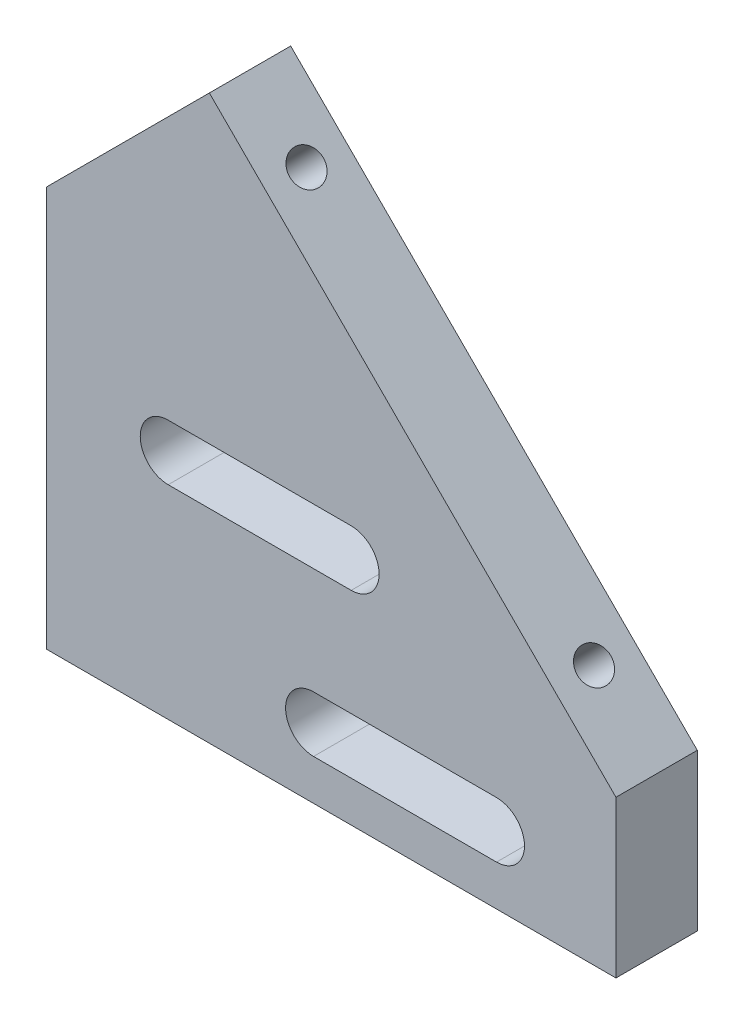
ISO-10303-21;
HEADER;
FILE_DESCRIPTION(('STEP AP214'),'2;1');
FILE_NAME('part.step','',(''),(''),'','','');
FILE_SCHEMA(('AUTOMOTIVE_DESIGN { 1 0 10303 214 1 1 1 1 }'));
ENDSEC;
DATA;
#1=APPLICATION_CONTEXT('core data for automotive mechanical design processes');
#2=APPLICATION_PROTOCOL_DEFINITION('international standard','automotive_design',2000,#1);
#3=PRODUCT_CONTEXT('',#1,'mechanical');
#4=PRODUCT('Part','Part','',(#3));
#5=PRODUCT_RELATED_PRODUCT_CATEGORY('part','',(#4));
#6=PRODUCT_DEFINITION_FORMATION('','',#4);
#7=PRODUCT_DEFINITION_CONTEXT('part definition',#1,'design');
#8=PRODUCT_DEFINITION('design','',#6,#7);
#9=PRODUCT_DEFINITION_SHAPE('','',#8);
#10=(LENGTH_UNIT() NAMED_UNIT(*) SI_UNIT(.MILLI.,.METRE.));
#11=(NAMED_UNIT(*) PLANE_ANGLE_UNIT() SI_UNIT($,.RADIAN.));
#12=(NAMED_UNIT(*) SI_UNIT($,.STERADIAN.) SOLID_ANGLE_UNIT());
#13=UNCERTAINTY_MEASURE_WITH_UNIT(LENGTH_MEASURE(1.E-05),#10,'distance_accuracy_value','');
#14=(GEOMETRIC_REPRESENTATION_CONTEXT(3) GLOBAL_UNCERTAINTY_ASSIGNED_CONTEXT((#13)) GLOBAL_UNIT_ASSIGNED_CONTEXT((#10,
#11,#12)) REPRESENTATION_CONTEXT('',''));
#15=CARTESIAN_POINT('',(0.,0.,0.));
#16=DIRECTION('',(0.,0.,1.));
#17=DIRECTION('',(1.,0.,0.));
#18=AXIS2_PLACEMENT_3D('',#15,#16,#17);
#19=CARTESIAN_POINT('',(49.842135623731,21.5578643762692,4.));
#20=DIRECTION('',(0.707106781186546,0.707106781186549,0.));
#21=DIRECTION('',(0.,0.,-1.));
#22=AXIS2_PLACEMENT_3D('',#19,#20,#21);
#23=CYLINDRICAL_SURFACE('',#22,1.64999999999999);
#24=CARTESIAN_POINT('',(41.7104076400857,13.4261363926239,4.));
#25=DIRECTION('',(0.707106781186546,0.707106781186549,0.));
#26=DIRECTION('',(0.,0.,-1.));
#27=AXIS2_PLACEMENT_3D('',#24,#25,#26);
#28=CIRCLE('',#27,1.64999999999999);
#29=CARTESIAN_POINT('',(41.7104076400857,13.4261363926239,2.35000000000002));
#30=VERTEX_POINT('',#29);
#31=EDGE_CURVE('E25',#30,#30,#28,.T.);
#32=ORIENTED_EDGE('',*,*,#31,.F.);
#33=EDGE_LOOP('',(#32));
#34=FACE_BOUND('',#33,.T.);
#35=CARTESIAN_POINT('',(49.842135623731,21.5578643762692,4.));
#36=DIRECTION('',(0.707106781186546,0.707106781186549,0.));
#37=DIRECTION('',(0.,0.,-1.));
#38=AXIS2_PLACEMENT_3D('',#35,#36,#37);
#39=CIRCLE('',#38,1.64999999999999);
#40=CARTESIAN_POINT('',(49.842135623731,21.5578643762692,2.35000000000001));
#41=VERTEX_POINT('',#40);
#42=EDGE_CURVE('E11',#41,#41,#39,.T.);
#43=ORIENTED_EDGE('',*,*,#42,.T.);
#44=EDGE_LOOP('',(#43));
#45=FACE_BOUND('',#44,.T.);
#46=ADVANCED_FACE('F16',(#34,#45),#23,.F.);
#47=CARTESIAN_POINT('',(41.7104076400857,13.4261363926239,4.));
#48=DIRECTION('',(0.707106781186546,0.707106781186549,0.));
#49=DIRECTION('',(0.,0.,-1.));
#50=AXIS2_PLACEMENT_3D('',#47,#48,#49);
#51=CONICAL_SURFACE('',#50,1.64999999999999,1.02974425867665);
#52=CARTESIAN_POINT('',(41.0093678199528,12.725096572491,4.));
#53=VERTEX_POINT('',#52);
#54=VERTEX_LOOP('',#53);
#55=FACE_BOUND('',#54,.T.);
#56=ORIENTED_EDGE('',*,*,#31,.T.);
#57=EDGE_LOOP('',(#56));
#58=FACE_BOUND('',#57,.T.);
#59=ADVANCED_FACE('F257',(#55,#58),#51,.F.);
#60=CARTESIAN_POINT('',(21.557864376269,49.842135623731,4.));
#61=DIRECTION('',(0.707106781186546,0.707106781186549,0.));
#62=DIRECTION('',(0.,0.,-1.));
#63=AXIS2_PLACEMENT_3D('',#60,#61,#62);
#64=CYLINDRICAL_SURFACE('',#63,1.64999999999999);
#65=CARTESIAN_POINT('',(13.4261363926237,41.7104076400857,4.));
#66=DIRECTION('',(0.707106781186546,0.707106781186549,0.));
#67=DIRECTION('',(0.,0.,-1.));
#68=AXIS2_PLACEMENT_3D('',#65,#66,#67);
#69=CIRCLE('',#68,1.64999999999999);
#70=CARTESIAN_POINT('',(13.4261363926237,41.7104076400857,2.35000000000001));
#71=VERTEX_POINT('',#70);
#72=EDGE_CURVE('E130',#71,#71,#69,.T.);
#73=ORIENTED_EDGE('',*,*,#72,.F.);
#74=EDGE_LOOP('',(#73));
#75=FACE_BOUND('',#74,.T.);
#76=CARTESIAN_POINT('',(21.557864376269,49.842135623731,4.));
#77=DIRECTION('',(0.707106781186546,0.707106781186549,0.));
#78=DIRECTION('',(0.,0.,-1.));
#79=AXIS2_PLACEMENT_3D('',#76,#77,#78);
#80=CIRCLE('',#79,1.64999999999999);
#81=CARTESIAN_POINT('',(21.557864376269,49.842135623731,2.35000000000001));
#82=VERTEX_POINT('',#81);
#83=EDGE_CURVE('E249',#82,#82,#80,.T.);
#84=ORIENTED_EDGE('',*,*,#83,.T.);
#85=EDGE_LOOP('',(#84));
#86=FACE_BOUND('',#85,.T.);
#87=ADVANCED_FACE('F273',(#75,#86),#64,.F.);
#88=CARTESIAN_POINT('',(13.4261363926237,41.7104076400857,4.));
#89=DIRECTION('',(0.707106781186546,0.707106781186549,0.));
#90=DIRECTION('',(0.,0.,-1.));
#91=AXIS2_PLACEMENT_3D('',#88,#89,#90);
#92=CONICAL_SURFACE('',#91,1.64999999999999,1.02974425867665);
#93=CARTESIAN_POINT('',(12.7250965724909,41.0093678199529,4.));
#94=VERTEX_POINT('',#93);
#95=VERTEX_LOOP('',#94);
#96=FACE_BOUND('',#95,.T.);
#97=ORIENTED_EDGE('',*,*,#72,.T.);
#98=EDGE_LOOP('',(#97));
#99=FACE_BOUND('',#98,.T.);
#100=ADVANCED_FACE('F275',(#96,#99),#92,.F.);
#101=CARTESIAN_POINT('',(11.95,22.75,8.));
#102=DIRECTION('',(0.,0.,-1.));
#103=DIRECTION('',(0.,-1.,0.));
#104=AXIS2_PLACEMENT_3D('',#101,#102,#103);
#105=CYLINDRICAL_SURFACE('',#104,2.75);
#106=CARTESIAN_POINT('',(11.95,22.75,8.));
#107=DIRECTION('',(0.,0.,1.));
#108=DIRECTION('',(1.,0.,0.));
#109=AXIS2_PLACEMENT_3D('',#106,#107,#108);
#110=CIRCLE('',#109,2.75);
#111=CARTESIAN_POINT('',(11.95,25.5,8.));
#112=VERTEX_POINT('',#111);
#113=CARTESIAN_POINT('',(11.95,20.,8.));
#114=VERTEX_POINT('',#113);
#115=EDGE_CURVE('E117',#112,#114,#110,.T.);
#116=ORIENTED_EDGE('',*,*,#115,.T.);
#117=DIRECTION('',(0.,0.,-1.));
#118=VECTOR('',#117,1.);
#119=CARTESIAN_POINT('',(11.95,20.,8.));
#120=LINE('',#119,#118);
#121=CARTESIAN_POINT('',(11.95,20.,0.));
#122=VERTEX_POINT('',#121);
#123=EDGE_CURVE('E131',#114,#122,#120,.T.);
#124=ORIENTED_EDGE('',*,*,#123,.T.);
#125=CARTESIAN_POINT('',(11.95,22.75,0.));
#126=DIRECTION('',(0.,0.,1.));
#127=DIRECTION('',(1.,0.,0.));
#128=AXIS2_PLACEMENT_3D('',#125,#126,#127);
#129=CIRCLE('',#128,2.75);
#130=CARTESIAN_POINT('',(11.95,25.5,0.));
#131=VERTEX_POINT('',#130);
#132=EDGE_CURVE('E119',#131,#122,#129,.T.);
#133=ORIENTED_EDGE('',*,*,#132,.F.);
#134=DIRECTION('',(0.,0.,-1.));
#135=VECTOR('',#134,1.);
#136=CARTESIAN_POINT('',(11.95,25.5,8.));
#137=LINE('',#136,#135);
#138=EDGE_CURVE('E113',#112,#131,#137,.T.);
#139=ORIENTED_EDGE('',*,*,#138,.F.);
#140=EDGE_LOOP('',(#116,#124,#133,#139));
#141=FACE_BOUND('',#140,.T.);
#142=ADVANCED_FACE('F115',(#141),#105,.F.);
#143=CARTESIAN_POINT('',(26.25,6.75,8.));
#144=DIRECTION('',(0.,0.,-1.));
#145=DIRECTION('',(0.,-1.,0.));
#146=AXIS2_PLACEMENT_3D('',#143,#144,#145);
#147=CYLINDRICAL_SURFACE('',#146,2.75);
#148=CARTESIAN_POINT('',(26.25,6.75,8.));
#149=DIRECTION('',(0.,0.,1.));
#150=DIRECTION('',(1.,0.,0.));
#151=AXIS2_PLACEMENT_3D('',#148,#149,#150);
#152=CIRCLE('',#151,2.75);
#153=CARTESIAN_POINT('',(26.25,9.5,8.));
#154=VERTEX_POINT('',#153);
#155=CARTESIAN_POINT('',(26.25,4.,8.));
#156=VERTEX_POINT('',#155);
#157=EDGE_CURVE('E243',#154,#156,#152,.T.);
#158=ORIENTED_EDGE('',*,*,#157,.T.);
#159=DIRECTION('',(0.,0.,-1.));
#160=VECTOR('',#159,1.);
#161=CARTESIAN_POINT('',(26.25,4.,8.));
#162=LINE('',#161,#160);
#163=CARTESIAN_POINT('',(26.25,4.,0.));
#164=VERTEX_POINT('',#163);
#165=EDGE_CURVE('E214',#156,#164,#162,.T.);
#166=ORIENTED_EDGE('',*,*,#165,.T.);
#167=CARTESIAN_POINT('',(26.25,6.75,0.));
#168=DIRECTION('',(0.,0.,1.));
#169=DIRECTION('',(1.,0.,0.));
#170=AXIS2_PLACEMENT_3D('',#167,#168,#169);
#171=CIRCLE('',#170,2.75);
#172=CARTESIAN_POINT('',(26.25,9.5,0.));
#173=VERTEX_POINT('',#172);
#174=EDGE_CURVE('E171',#173,#164,#171,.T.);
#175=ORIENTED_EDGE('',*,*,#174,.F.);
#176=DIRECTION('',(0.,0.,-1.));
#177=VECTOR('',#176,1.);
#178=CARTESIAN_POINT('',(26.25,9.5,8.));
#179=LINE('',#178,#177);
#180=EDGE_CURVE('E202',#154,#173,#179,.T.);
#181=ORIENTED_EDGE('',*,*,#180,.F.);
#182=EDGE_LOOP('',(#158,#166,#175,#181));
#183=FACE_BOUND('',#182,.T.);
#184=ADVANCED_FACE('F289',(#183),#147,.F.);
#185=CARTESIAN_POINT('',(0.,0.,8.));
#186=DIRECTION('',(0.,0.,1.));
#187=DIRECTION('',(1.,0.,0.));
#188=AXIS2_PLACEMENT_3D('',#185,#186,#187);
#189=PLANE('',#188);
#190=DIRECTION('',(0.,-1.,0.));
#191=VECTOR('',#190,1.);
#192=CARTESIAN_POINT('',(0.,39.4,8.));
#193=LINE('',#192,#191);
#194=CARTESIAN_POINT('',(0.,39.4,8.));
#195=VERTEX_POINT('',#194);
#196=CARTESIAN_POINT('',(0.,0.,8.));
#197=VERTEX_POINT('',#196);
#198=EDGE_CURVE('E211',#195,#197,#193,.T.);
#199=ORIENTED_EDGE('',*,*,#198,.T.);
#200=DIRECTION('',(1.,0.,0.));
#201=VECTOR('',#200,1.);
#202=CARTESIAN_POINT('',(0.,0.,8.));
#203=LINE('',#202,#201);
#204=CARTESIAN_POINT('',(56.,0.,8.));
#205=VERTEX_POINT('',#204);
#206=EDGE_CURVE('E215',#197,#205,#203,.T.);
#207=ORIENTED_EDGE('',*,*,#206,.T.);
#208=DIRECTION('',(0.,1.,0.));
#209=VECTOR('',#208,1.);
#210=CARTESIAN_POINT('',(56.,0.,8.));
#211=LINE('',#210,#209);
#212=CARTESIAN_POINT('',(56.,15.4000000000002,8.));
#213=VERTEX_POINT('',#212);
#214=EDGE_CURVE('E218',#205,#213,#211,.T.);
#215=ORIENTED_EDGE('',*,*,#214,.T.);
#216=DIRECTION('',(-0.707106781186549,0.707106781186546,0.));
#217=VECTOR('',#216,1.);
#218=CARTESIAN_POINT('',(56.,15.4000000000002,8.));
#219=LINE('',#218,#217);
#220=CARTESIAN_POINT('',(16.,55.4,8.));
#221=VERTEX_POINT('',#220);
#222=EDGE_CURVE('E221',#213,#221,#219,.T.);
#223=ORIENTED_EDGE('',*,*,#222,.T.);
#224=DIRECTION('',(-0.707106781186549,-0.707106781186546,0.));
#225=VECTOR('',#224,1.);
#226=CARTESIAN_POINT('',(16.,55.4,8.));
#227=LINE('',#226,#225);
#228=EDGE_CURVE('E224',#221,#195,#227,.T.);
#229=ORIENTED_EDGE('',*,*,#228,.T.);
#230=EDGE_LOOP('',(#199,#207,#215,#223,#229));
#231=FACE_BOUND('',#230,.T.);
#232=DIRECTION('',(1.,0.,0.));
#233=VECTOR('',#232,1.);
#234=CARTESIAN_POINT('',(26.25,4.,8.));
#235=LINE('',#234,#233);
#236=CARTESIAN_POINT('',(44.25,4.00000000000001,8.));
#237=VERTEX_POINT('',#236);
#238=EDGE_CURVE('E190',#156,#237,#235,.T.);
#239=ORIENTED_EDGE('',*,*,#238,.F.);
#240=ORIENTED_EDGE('',*,*,#157,.F.);
#241=DIRECTION('',(-1.,0.,0.));
#242=VECTOR('',#241,1.);
#243=CARTESIAN_POINT('',(26.25,9.5,8.));
#244=LINE('',#243,#242);
#245=CARTESIAN_POINT('',(44.25,9.5,8.));
#246=VERTEX_POINT('',#245);
#247=EDGE_CURVE('E197',#246,#154,#244,.T.);
#248=ORIENTED_EDGE('',*,*,#247,.F.);
#249=CARTESIAN_POINT('',(44.25,6.75,8.));
#250=DIRECTION('',(0.,0.,1.));
#251=DIRECTION('',(1.,0.,0.));
#252=AXIS2_PLACEMENT_3D('',#249,#250,#251);
#253=CIRCLE('',#252,2.75);
#254=EDGE_CURVE('E194',#237,#246,#253,.T.);
#255=ORIENTED_EDGE('',*,*,#254,.F.);
#256=EDGE_LOOP('',(#239,#240,#248,#255));
#257=FACE_BOUND('',#256,.T.);
#258=DIRECTION('',(1.,0.,0.));
#259=VECTOR('',#258,1.);
#260=CARTESIAN_POINT('',(11.95,20.,8.));
#261=LINE('',#260,#259);
#262=CARTESIAN_POINT('',(29.95,20.,8.));
#263=VERTEX_POINT('',#262);
#264=EDGE_CURVE('E129',#114,#263,#261,.T.);
#265=ORIENTED_EDGE('',*,*,#264,.F.);
#266=ORIENTED_EDGE('',*,*,#115,.F.);
#267=DIRECTION('',(-1.,0.,0.));
#268=VECTOR('',#267,1.);
#269=CARTESIAN_POINT('',(11.95,25.5,8.));
#270=LINE('',#269,#268);
#271=CARTESIAN_POINT('',(29.95,25.5,8.));
#272=VERTEX_POINT('',#271);
#273=EDGE_CURVE('E123',#272,#112,#270,.T.);
#274=ORIENTED_EDGE('',*,*,#273,.F.);
#275=CARTESIAN_POINT('',(29.95,22.75,8.));
#276=DIRECTION('',(0.,0.,1.));
#277=DIRECTION('',(1.,0.,0.));
#278=AXIS2_PLACEMENT_3D('',#275,#276,#277);
#279=CIRCLE('',#278,2.75);
#280=EDGE_CURVE('E137',#263,#272,#279,.T.);
#281=ORIENTED_EDGE('',*,*,#280,.F.);
#282=EDGE_LOOP('',(#265,#266,#274,#281));
#283=FACE_BOUND('',#282,.T.);
#284=ADVANCED_FACE('F126',(#231,#257,#283),#189,.T.);
#285=CARTESIAN_POINT('',(0.,0.,0.));
#286=DIRECTION('',(0.,0.,1.));
#287=DIRECTION('',(1.,0.,0.));
#288=AXIS2_PLACEMENT_3D('',#285,#286,#287);
#289=PLANE('',#288);
#290=DIRECTION('',(0.,-1.,0.));
#291=VECTOR('',#290,1.);
#292=CARTESIAN_POINT('',(0.,39.4,0.));
#293=LINE('',#292,#291);
#294=CARTESIAN_POINT('',(0.,39.4,0.));
#295=VERTEX_POINT('',#294);
#296=CARTESIAN_POINT('',(0.,0.,0.));
#297=VERTEX_POINT('',#296);
#298=EDGE_CURVE('E143',#295,#297,#293,.T.);
#299=ORIENTED_EDGE('',*,*,#298,.F.);
#300=DIRECTION('',(-0.707106781186549,-0.707106781186546,0.));
#301=VECTOR('',#300,1.);
#302=CARTESIAN_POINT('',(16.,55.4,0.));
#303=LINE('',#302,#301);
#304=CARTESIAN_POINT('',(16.,55.4,0.));
#305=VERTEX_POINT('',#304);
#306=EDGE_CURVE('E148',#305,#295,#303,.T.);
#307=ORIENTED_EDGE('',*,*,#306,.F.);
#308=DIRECTION('',(-0.707106781186549,0.707106781186546,0.));
#309=VECTOR('',#308,1.);
#310=CARTESIAN_POINT('',(56.,15.4000000000002,0.));
#311=LINE('',#310,#309);
#312=CARTESIAN_POINT('',(56.,15.4000000000002,0.));
#313=VERTEX_POINT('',#312);
#314=EDGE_CURVE('E152',#313,#305,#311,.T.);
#315=ORIENTED_EDGE('',*,*,#314,.F.);
#316=DIRECTION('',(0.,1.,0.));
#317=VECTOR('',#316,1.);
#318=CARTESIAN_POINT('',(56.,0.,0.));
#319=LINE('',#318,#317);
#320=CARTESIAN_POINT('',(56.,0.,0.));
#321=VERTEX_POINT('',#320);
#322=EDGE_CURVE('E156',#321,#313,#319,.T.);
#323=ORIENTED_EDGE('',*,*,#322,.F.);
#324=DIRECTION('',(1.,0.,0.));
#325=VECTOR('',#324,1.);
#326=CARTESIAN_POINT('',(0.,0.,0.));
#327=LINE('',#326,#325);
#328=EDGE_CURVE('E160',#297,#321,#327,.T.);
#329=ORIENTED_EDGE('',*,*,#328,.F.);
#330=EDGE_LOOP('',(#299,#307,#315,#323,#329));
#331=FACE_BOUND('',#330,.T.);
#332=ORIENTED_EDGE('',*,*,#132,.T.);
#333=DIRECTION('',(1.,0.,0.));
#334=VECTOR('',#333,1.);
#335=CARTESIAN_POINT('',(11.95,20.,0.));
#336=LINE('',#335,#334);
#337=CARTESIAN_POINT('',(29.95,20.,0.));
#338=VERTEX_POINT('',#337);
#339=EDGE_CURVE('E163',#122,#338,#336,.T.);
#340=ORIENTED_EDGE('',*,*,#339,.T.);
#341=CARTESIAN_POINT('',(29.95,22.75,0.));
#342=DIRECTION('',(0.,0.,1.));
#343=DIRECTION('',(1.,0.,0.));
#344=AXIS2_PLACEMENT_3D('',#341,#342,#343);
#345=CIRCLE('',#344,2.75);
#346=CARTESIAN_POINT('',(29.95,25.5,0.));
#347=VERTEX_POINT('',#346);
#348=EDGE_CURVE('E166',#338,#347,#345,.T.);
#349=ORIENTED_EDGE('',*,*,#348,.T.);
#350=DIRECTION('',(-1.,0.,0.));
#351=VECTOR('',#350,1.);
#352=CARTESIAN_POINT('',(11.95,25.5,0.));
#353=LINE('',#352,#351);
#354=EDGE_CURVE('E169',#347,#131,#353,.T.);
#355=ORIENTED_EDGE('',*,*,#354,.T.);
#356=EDGE_LOOP('',(#332,#340,#349,#355));
#357=FACE_BOUND('',#356,.T.);
#358=ORIENTED_EDGE('',*,*,#174,.T.);
#359=DIRECTION('',(1.,0.,0.));
#360=VECTOR('',#359,1.);
#361=CARTESIAN_POINT('',(26.25,4.,0.));
#362=LINE('',#361,#360);
#363=CARTESIAN_POINT('',(44.25,4.00000000000001,0.));
#364=VERTEX_POINT('',#363);
#365=EDGE_CURVE('E172',#164,#364,#362,.T.);
#366=ORIENTED_EDGE('',*,*,#365,.T.);
#367=CARTESIAN_POINT('',(44.25,6.75,0.));
#368=DIRECTION('',(0.,0.,1.));
#369=DIRECTION('',(1.,0.,0.));
#370=AXIS2_PLACEMENT_3D('',#367,#368,#369);
#371=CIRCLE('',#370,2.75);
#372=CARTESIAN_POINT('',(44.25,9.5,0.));
#373=VERTEX_POINT('',#372);
#374=EDGE_CURVE('E175',#364,#373,#371,.T.);
#375=ORIENTED_EDGE('',*,*,#374,.T.);
#376=DIRECTION('',(-1.,0.,0.));
#377=VECTOR('',#376,1.);
#378=CARTESIAN_POINT('',(26.25,9.5,0.));
#379=LINE('',#378,#377);
#380=EDGE_CURVE('E146',#373,#173,#379,.T.);
#381=ORIENTED_EDGE('',*,*,#380,.T.);
#382=EDGE_LOOP('',(#358,#366,#375,#381));
#383=FACE_BOUND('',#382,.T.);
#384=ADVANCED_FACE('F236',(#331,#357,#383),#289,.F.);
#385=CARTESIAN_POINT('',(0.,39.4,8.));
#386=DIRECTION('',(1.,0.,0.));
#387=DIRECTION('',(0.,1.,0.));
#388=AXIS2_PLACEMENT_3D('',#385,#386,#387);
#389=PLANE('',#388);
#390=ORIENTED_EDGE('',*,*,#298,.T.);
#391=DIRECTION('',(0.,0.,-1.));
#392=VECTOR('',#391,1.);
#393=CARTESIAN_POINT('',(0.,0.,8.));
#394=LINE('',#393,#392);
#395=EDGE_CURVE('E159',#197,#297,#394,.T.);
#396=ORIENTED_EDGE('',*,*,#395,.F.);
#397=ORIENTED_EDGE('',*,*,#198,.F.);
#398=DIRECTION('',(0.,0.,-1.));
#399=VECTOR('',#398,1.);
#400=CARTESIAN_POINT('',(0.,39.4,8.));
#401=LINE('',#400,#399);
#402=EDGE_CURVE('E147',#195,#295,#401,.T.);
#403=ORIENTED_EDGE('',*,*,#402,.T.);
#404=EDGE_LOOP('',(#390,#396,#397,#403));
#405=FACE_BOUND('',#404,.T.);
#406=ADVANCED_FACE('F316',(#405),#389,.F.);
#407=CARTESIAN_POINT('',(0.,0.,8.));
#408=DIRECTION('',(0.,1.,0.));
#409=DIRECTION('',(0.,0.,1.));
#410=AXIS2_PLACEMENT_3D('',#407,#408,#409);
#411=PLANE('',#410);
#412=ORIENTED_EDGE('',*,*,#328,.T.);
#413=DIRECTION('',(0.,0.,-1.));
#414=VECTOR('',#413,1.);
#415=CARTESIAN_POINT('',(56.,0.,8.));
#416=LINE('',#415,#414);
#417=EDGE_CURVE('E155',#205,#321,#416,.T.);
#418=ORIENTED_EDGE('',*,*,#417,.F.);
#419=ORIENTED_EDGE('',*,*,#206,.F.);
#420=ORIENTED_EDGE('',*,*,#395,.T.);
#421=EDGE_LOOP('',(#412,#418,#419,#420));
#422=FACE_BOUND('',#421,.T.);
#423=ADVANCED_FACE('F323',(#422),#411,.F.);
#424=CARTESIAN_POINT('',(56.,0.,8.));
#425=DIRECTION('',(-1.,0.,0.));
#426=DIRECTION('',(0.,0.,1.));
#427=AXIS2_PLACEMENT_3D('',#424,#425,#426);
#428=PLANE('',#427);
#429=ORIENTED_EDGE('',*,*,#322,.T.);
#430=DIRECTION('',(0.,0.,-1.));
#431=VECTOR('',#430,1.);
#432=CARTESIAN_POINT('',(56.,15.4000000000002,8.));
#433=LINE('',#432,#431);
#434=EDGE_CURVE('E150',#213,#313,#433,.T.);
#435=ORIENTED_EDGE('',*,*,#434,.F.);
#436=ORIENTED_EDGE('',*,*,#214,.F.);
#437=ORIENTED_EDGE('',*,*,#417,.T.);
#438=EDGE_LOOP('',(#429,#435,#436,#437));
#439=FACE_BOUND('',#438,.T.);
#440=ADVANCED_FACE('F268',(#439),#428,.F.);
#441=CARTESIAN_POINT('',(56.,15.4000000000002,8.));
#442=DIRECTION('',(-0.707106781186546,-0.707106781186549,0.));
#443=DIRECTION('',(0.707106781186549,-0.707106781186546,0.));
#444=AXIS2_PLACEMENT_3D('',#441,#442,#443);
#445=PLANE('',#444);
#446=ORIENTED_EDGE('',*,*,#314,.T.);
#447=DIRECTION('',(0.,0.,-1.));
#448=VECTOR('',#447,1.);
#449=CARTESIAN_POINT('',(16.,55.4,8.));
#450=LINE('',#449,#448);
#451=EDGE_CURVE('E151',#221,#305,#450,.T.);
#452=ORIENTED_EDGE('',*,*,#451,.F.);
#453=ORIENTED_EDGE('',*,*,#222,.F.);
#454=ORIENTED_EDGE('',*,*,#434,.T.);
#455=EDGE_LOOP('',(#446,#452,#453,#454));
#456=FACE_BOUND('',#455,.T.);
#457=ORIENTED_EDGE('',*,*,#42,.F.);
#458=EDGE_LOOP('',(#457));
#459=FACE_BOUND('',#458,.T.);
#460=ORIENTED_EDGE('',*,*,#83,.F.);
#461=EDGE_LOOP('',(#460));
#462=FACE_BOUND('',#461,.T.);
#463=ADVANCED_FACE('F264',(#456,#459,#462),#445,.F.);
#464=CARTESIAN_POINT('',(16.,55.4,8.));
#465=DIRECTION('',(0.707106781186546,-0.707106781186549,0.));
#466=DIRECTION('',(0.707106781186549,0.707106781186546,0.));
#467=AXIS2_PLACEMENT_3D('',#464,#465,#466);
#468=PLANE('',#467);
#469=ORIENTED_EDGE('',*,*,#306,.T.);
#470=ORIENTED_EDGE('',*,*,#402,.F.);
#471=ORIENTED_EDGE('',*,*,#228,.F.);
#472=ORIENTED_EDGE('',*,*,#451,.T.);
#473=EDGE_LOOP('',(#469,#470,#471,#472));
#474=FACE_BOUND('',#473,.T.);
#475=ADVANCED_FACE('F267',(#474),#468,.F.);
#476=CARTESIAN_POINT('',(26.25,4.,8.));
#477=DIRECTION('',(0.,1.,0.));
#478=DIRECTION('',(-1.,0.,0.));
#479=AXIS2_PLACEMENT_3D('',#476,#477,#478);
#480=PLANE('',#479);
#481=ORIENTED_EDGE('',*,*,#365,.F.);
#482=ORIENTED_EDGE('',*,*,#165,.F.);
#483=ORIENTED_EDGE('',*,*,#238,.T.);
#484=DIRECTION('',(0.,0.,-1.));
#485=VECTOR('',#484,1.);
#486=CARTESIAN_POINT('',(44.25,4.00000000000001,8.));
#487=LINE('',#486,#485);
#488=EDGE_CURVE('E191',#237,#364,#487,.T.);
#489=ORIENTED_EDGE('',*,*,#488,.T.);
#490=EDGE_LOOP('',(#481,#482,#483,#489));
#491=FACE_BOUND('',#490,.T.);
#492=ADVANCED_FACE('F240',(#491),#480,.T.);
#493=CARTESIAN_POINT('',(44.25,6.75,8.));
#494=DIRECTION('',(0.,0.,-1.));
#495=DIRECTION('',(0.,-1.,0.));
#496=AXIS2_PLACEMENT_3D('',#493,#494,#495);
#497=CYLINDRICAL_SURFACE('',#496,2.75);
#498=ORIENTED_EDGE('',*,*,#374,.F.);
#499=ORIENTED_EDGE('',*,*,#488,.F.);
#500=ORIENTED_EDGE('',*,*,#254,.T.);
#501=DIRECTION('',(0.,0.,-1.));
#502=VECTOR('',#501,1.);
#503=CARTESIAN_POINT('',(44.25,9.5,8.));
#504=LINE('',#503,#502);
#505=EDGE_CURVE('E195',#246,#373,#504,.T.);
#506=ORIENTED_EDGE('',*,*,#505,.T.);
#507=EDGE_LOOP('',(#498,#499,#500,#506));
#508=FACE_BOUND('',#507,.T.);
#509=ADVANCED_FACE('F231',(#508),#497,.F.);
#510=CARTESIAN_POINT('',(26.25,9.5,8.));
#511=DIRECTION('',(0.,-1.,0.));
#512=DIRECTION('',(0.,0.,-1.));
#513=AXIS2_PLACEMENT_3D('',#510,#511,#512);
#514=PLANE('',#513);
#515=ORIENTED_EDGE('',*,*,#380,.F.);
#516=ORIENTED_EDGE('',*,*,#505,.F.);
#517=ORIENTED_EDGE('',*,*,#247,.T.);
#518=ORIENTED_EDGE('',*,*,#180,.T.);
#519=EDGE_LOOP('',(#515,#516,#517,#518));
#520=FACE_BOUND('',#519,.T.);
#521=ADVANCED_FACE('F234',(#520),#514,.T.);
#522=CARTESIAN_POINT('',(11.95,20.,8.));
#523=DIRECTION('',(0.,1.,0.));
#524=DIRECTION('',(-1.,0.,0.));
#525=AXIS2_PLACEMENT_3D('',#522,#523,#524);
#526=PLANE('',#525);
#527=ORIENTED_EDGE('',*,*,#339,.F.);
#528=ORIENTED_EDGE('',*,*,#123,.F.);
#529=ORIENTED_EDGE('',*,*,#264,.T.);
#530=DIRECTION('',(0.,0.,-1.));
#531=VECTOR('',#530,1.);
#532=CARTESIAN_POINT('',(29.95,20.,8.));
#533=LINE('',#532,#531);
#534=EDGE_CURVE('E142',#263,#338,#533,.T.);
#535=ORIENTED_EDGE('',*,*,#534,.T.);
#536=EDGE_LOOP('',(#527,#528,#529,#535));
#537=FACE_BOUND('',#536,.T.);
#538=ADVANCED_FACE('F296',(#537),#526,.T.);
#539=CARTESIAN_POINT('',(29.95,22.75,8.));
#540=DIRECTION('',(0.,0.,-1.));
#541=DIRECTION('',(0.,-1.,0.));
#542=AXIS2_PLACEMENT_3D('',#539,#540,#541);
#543=CYLINDRICAL_SURFACE('',#542,2.75);
#544=ORIENTED_EDGE('',*,*,#348,.F.);
#545=ORIENTED_EDGE('',*,*,#534,.F.);
#546=ORIENTED_EDGE('',*,*,#280,.T.);
#547=DIRECTION('',(0.,0.,-1.));
#548=VECTOR('',#547,1.);
#549=CARTESIAN_POINT('',(29.95,25.5,8.));
#550=LINE('',#549,#548);
#551=EDGE_CURVE('E20',#272,#347,#550,.T.);
#552=ORIENTED_EDGE('',*,*,#551,.T.);
#553=EDGE_LOOP('',(#544,#545,#546,#552));
#554=FACE_BOUND('',#553,.T.);
#555=ADVANCED_FACE('F18',(#554),#543,.F.);
#556=CARTESIAN_POINT('',(11.95,25.5,8.));
#557=DIRECTION('',(0.,-1.,0.));
#558=DIRECTION('',(0.,0.,-1.));
#559=AXIS2_PLACEMENT_3D('',#556,#557,#558);
#560=PLANE('',#559);
#561=ORIENTED_EDGE('',*,*,#354,.F.);
#562=ORIENTED_EDGE('',*,*,#551,.F.);
#563=ORIENTED_EDGE('',*,*,#273,.T.);
#564=ORIENTED_EDGE('',*,*,#138,.T.);
#565=EDGE_LOOP('',(#561,#562,#563,#564));
#566=FACE_BOUND('',#565,.T.);
#567=ADVANCED_FACE('F134',(#566),#560,.T.);
#568=CLOSED_SHELL('',(#46,#59,#87,#100,#142,#184,#284,#384,#406,#423,#440,#463,#475,#492,#509,
#521,#538,#555,#567));
#569=MANIFOLD_SOLID_BREP('B1',#568);
#570=ADVANCED_BREP_SHAPE_REPRESENTATION('',(#18,#569),#14);
#571=SHAPE_DEFINITION_REPRESENTATION(#9,#570);
ENDSEC;
END-ISO-10303-21;
